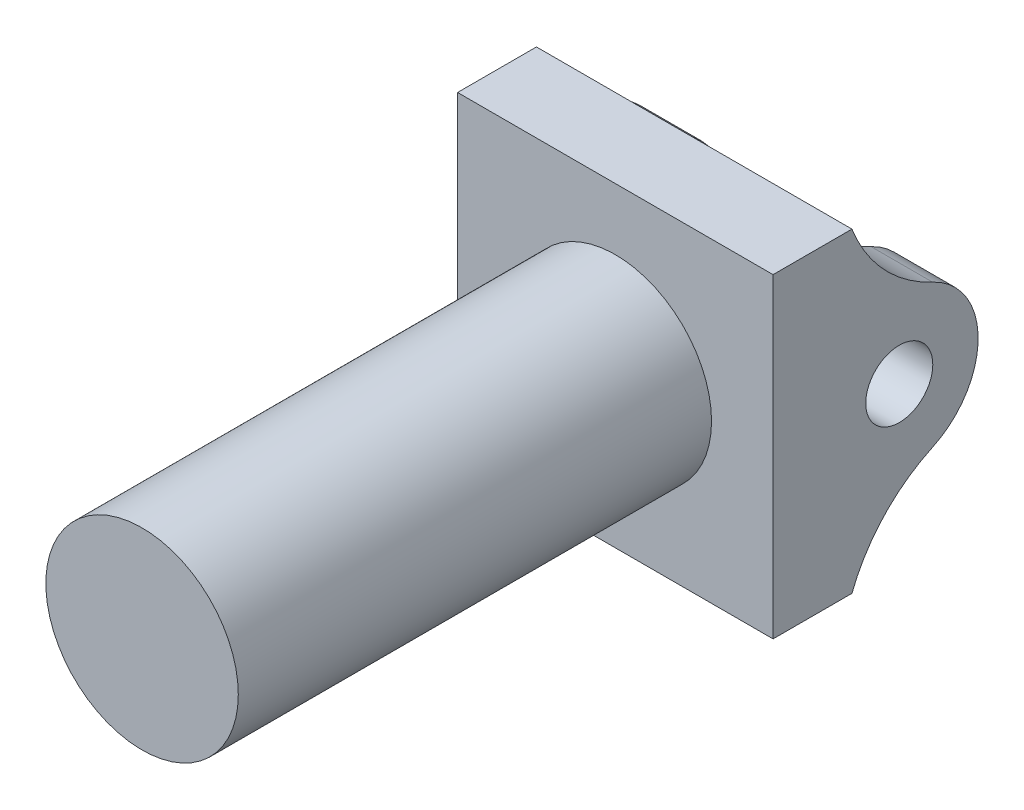
ISO-10303-21;
HEADER;
FILE_DESCRIPTION(('STEP AP214'),'2;1');
FILE_NAME('part.step','',(''),(''),'','','');
FILE_SCHEMA(('AUTOMOTIVE_DESIGN { 1 0 10303 214 1 1 1 1 }'));
ENDSEC;
DATA;
#1=APPLICATION_CONTEXT('core data for automotive mechanical design processes');
#2=APPLICATION_PROTOCOL_DEFINITION('international standard','automotive_design',2000,#1);
#3=PRODUCT_CONTEXT('',#1,'mechanical');
#4=PRODUCT('Part','Part','',(#3));
#5=PRODUCT_RELATED_PRODUCT_CATEGORY('part','',(#4));
#6=PRODUCT_DEFINITION_FORMATION('','',#4);
#7=PRODUCT_DEFINITION_CONTEXT('part definition',#1,'design');
#8=PRODUCT_DEFINITION('design','',#6,#7);
#9=PRODUCT_DEFINITION_SHAPE('','',#8);
#10=(LENGTH_UNIT() NAMED_UNIT(*) SI_UNIT(.MILLI.,.METRE.));
#11=(NAMED_UNIT(*) PLANE_ANGLE_UNIT() SI_UNIT($,.RADIAN.));
#12=(NAMED_UNIT(*) SI_UNIT($,.STERADIAN.) SOLID_ANGLE_UNIT());
#13=UNCERTAINTY_MEASURE_WITH_UNIT(LENGTH_MEASURE(1.E-05),#10,'distance_accuracy_value','');
#14=(GEOMETRIC_REPRESENTATION_CONTEXT(3) GLOBAL_UNCERTAINTY_ASSIGNED_CONTEXT((#13)) GLOBAL_UNIT_ASSIGNED_CONTEXT((#10,
#11,#12)) REPRESENTATION_CONTEXT('',''));
#15=CARTESIAN_POINT('',(0.,0.,0.));
#16=DIRECTION('',(0.,0.,1.));
#17=DIRECTION('',(1.,0.,0.));
#18=AXIS2_PLACEMENT_3D('',#15,#16,#17);
#19=CARTESIAN_POINT('',(-10.,0.,-8.));
#20=DIRECTION('',(1.,0.,0.));
#21=DIRECTION('',(0.,0.,-1.));
#22=AXIS2_PLACEMENT_3D('',#19,#20,#21);
#23=CYLINDRICAL_SURFACE('',#22,5.);
#24=CARTESIAN_POINT('',(6.1,0.,-8.));
#25=DIRECTION('',(-1.,0.,0.));
#26=DIRECTION('',(0.,0.,1.));
#27=AXIS2_PLACEMENT_3D('',#24,#25,#26);
#28=CIRCLE('',#27,5.);
#29=CARTESIAN_POINT('',(6.1,-4.53299182970078,-10.1099727656693));
#30=VERTEX_POINT('',#29);
#31=CARTESIAN_POINT('',(6.1,4.53299182970078,-10.1099727656693));
#32=VERTEX_POINT('',#31);
#33=EDGE_CURVE('E220',#30,#32,#28,.F.);
#34=ORIENTED_EDGE('',*,*,#33,.T.);
#35=DIRECTION('',(1.,0.,0.));
#36=VECTOR('',#35,1.);
#37=CARTESIAN_POINT('',(-10.,4.53299182970078,-10.1099727656693));
#38=LINE('',#37,#36);
#39=CARTESIAN_POINT('',(10.,4.53299182970078,-10.1099727656693));
#40=VERTEX_POINT('',#39);
#41=EDGE_CURVE('E164',#32,#40,#38,.T.);
#42=ORIENTED_EDGE('',*,*,#41,.T.);
#43=CARTESIAN_POINT('',(10.,0.,-8.));
#44=DIRECTION('',(1.,0.,0.));
#45=DIRECTION('',(0.,0.,-1.));
#46=AXIS2_PLACEMENT_3D('',#43,#44,#45);
#47=CIRCLE('',#46,5.);
#48=CARTESIAN_POINT('',(10.,-4.53299182970078,-10.1099727656693));
#49=VERTEX_POINT('',#48);
#50=EDGE_CURVE('E239',#49,#40,#47,.T.);
#51=ORIENTED_EDGE('',*,*,#50,.F.);
#52=DIRECTION('',(1.,0.,0.));
#53=VECTOR('',#52,1.);
#54=CARTESIAN_POINT('',(-10.,-4.53299182970078,-10.1099727656693));
#55=LINE('',#54,#53);
#56=EDGE_CURVE('E248',#49,#30,#55,.F.);
#57=ORIENTED_EDGE('',*,*,#56,.T.);
#58=EDGE_LOOP('',(#34,#42,#51,#57));
#59=FACE_BOUND('',#58,.T.);
#60=ADVANCED_FACE('F45',(#59),#23,.T.);
#61=CARTESIAN_POINT('',(-10.,0.,-8.));
#62=DIRECTION('',(1.,0.,0.));
#63=DIRECTION('',(0.,0.,-1.));
#64=AXIS2_PLACEMENT_3D('',#61,#62,#63);
#65=CIRCLE('',#64,5.);
#66=CARTESIAN_POINT('',(-10.,-4.53299182970078,-10.1099727656693));
#67=VERTEX_POINT('',#66);
#68=CARTESIAN_POINT('',(-10.,4.53299182970078,-10.1099727656693));
#69=VERTEX_POINT('',#68);
#70=EDGE_CURVE('E179',#67,#69,#65,.T.);
#71=ORIENTED_EDGE('',*,*,#70,.T.);
#72=DIRECTION('',(1.,0.,0.));
#73=VECTOR('',#72,1.);
#74=CARTESIAN_POINT('',(-10.,4.53299182970078,-10.1099727656693));
#75=LINE('',#74,#73);
#76=CARTESIAN_POINT('',(-6.1,4.53299182970078,-10.1099727656693));
#77=VERTEX_POINT('',#76);
#78=EDGE_CURVE('E155',#69,#77,#75,.T.);
#79=ORIENTED_EDGE('',*,*,#78,.T.);
#80=CARTESIAN_POINT('',(-6.1,0.,-8.));
#81=DIRECTION('',(1.,0.,0.));
#82=DIRECTION('',(0.,0.,-1.));
#83=AXIS2_PLACEMENT_3D('',#80,#81,#82);
#84=CIRCLE('',#83,5.);
#85=CARTESIAN_POINT('',(-6.1,-4.53299182970078,-10.1099727656693));
#86=VERTEX_POINT('',#85);
#87=EDGE_CURVE('E232',#77,#86,#84,.F.);
#88=ORIENTED_EDGE('',*,*,#87,.T.);
#89=DIRECTION('',(1.,0.,0.));
#90=VECTOR('',#89,1.);
#91=CARTESIAN_POINT('',(-10.,-4.53299182970078,-10.1099727656693));
#92=LINE('',#91,#90);
#93=EDGE_CURVE('E253',#86,#67,#92,.F.);
#94=ORIENTED_EDGE('',*,*,#93,.T.);
#95=EDGE_LOOP('',(#71,#79,#88,#94));
#96=FACE_BOUND('',#95,.T.);
#97=ADVANCED_FACE('F302',(#96),#23,.T.);
#98=CARTESIAN_POINT('',(-10.,0.,-8.));
#99=DIRECTION('',(1.,0.,0.));
#100=DIRECTION('',(0.,0.,-1.));
#101=AXIS2_PLACEMENT_3D('',#98,#99,#100);
#102=CYLINDRICAL_SURFACE('',#101,2.125);
#103=CARTESIAN_POINT('',(10.,0.,-8.));
#104=DIRECTION('',(1.,0.,0.));
#105=DIRECTION('',(0.,0.,-1.));
#106=AXIS2_PLACEMENT_3D('',#103,#104,#105);
#107=CIRCLE('',#106,2.125);
#108=CARTESIAN_POINT('',(10.,0.,-10.125));
#109=VERTEX_POINT('',#108);
#110=EDGE_CURVE('E223',#109,#109,#107,.T.);
#111=ORIENTED_EDGE('',*,*,#110,.T.);
#112=EDGE_LOOP('',(#111));
#113=FACE_BOUND('',#112,.T.);
#114=CARTESIAN_POINT('',(6.1,0.,-8.));
#115=DIRECTION('',(-1.,0.,0.));
#116=DIRECTION('',(0.,0.,1.));
#117=AXIS2_PLACEMENT_3D('',#114,#115,#116);
#118=CIRCLE('',#117,2.125);
#119=CARTESIAN_POINT('',(6.1,0.,-5.875));
#120=VERTEX_POINT('',#119);
#121=EDGE_CURVE('E224',#120,#120,#118,.F.);
#122=ORIENTED_EDGE('',*,*,#121,.F.);
#123=EDGE_LOOP('',(#122));
#124=FACE_BOUND('',#123,.T.);
#125=ADVANCED_FACE('F308',(#113,#124),#102,.F.);
#126=CARTESIAN_POINT('',(-10.,0.,-8.));
#127=DIRECTION('',(1.,0.,0.));
#128=DIRECTION('',(0.,0.,-1.));
#129=AXIS2_PLACEMENT_3D('',#126,#127,#128);
#130=CIRCLE('',#129,2.125);
#131=CARTESIAN_POINT('',(-10.,0.,-10.125));
#132=VERTEX_POINT('',#131);
#133=EDGE_CURVE('E229',#132,#132,#130,.T.);
#134=ORIENTED_EDGE('',*,*,#133,.F.);
#135=EDGE_LOOP('',(#134));
#136=FACE_BOUND('',#135,.T.);
#137=CARTESIAN_POINT('',(-6.1,0.,-8.));
#138=DIRECTION('',(1.,0.,0.));
#139=DIRECTION('',(0.,0.,-1.));
#140=AXIS2_PLACEMENT_3D('',#137,#138,#139);
#141=CIRCLE('',#140,2.125);
#142=CARTESIAN_POINT('',(-6.1,0.,-10.125));
#143=VERTEX_POINT('',#142);
#144=EDGE_CURVE('E259',#143,#143,#141,.F.);
#145=ORIENTED_EDGE('',*,*,#144,.F.);
#146=EDGE_LOOP('',(#145));
#147=FACE_BOUND('',#146,.T.);
#148=ADVANCED_FACE('F311',(#136,#147),#102,.F.);
#149=CARTESIAN_POINT('',(0.,0.,30.));
#150=DIRECTION('',(0.,0.,-1.));
#151=DIRECTION('',(-1.,0.,0.));
#152=AXIS2_PLACEMENT_3D('',#149,#150,#151);
#153=CYLINDRICAL_SURFACE('',#152,6.1);
#154=CARTESIAN_POINT('',(0.,0.,30.));
#155=DIRECTION('',(0.,0.,1.));
#156=DIRECTION('',(1.,0.,0.));
#157=AXIS2_PLACEMENT_3D('',#154,#155,#156);
#158=CIRCLE('',#157,6.1);
#159=CARTESIAN_POINT('',(6.1,0.,30.));
#160=VERTEX_POINT('',#159);
#161=EDGE_CURVE('E257',#160,#160,#158,.T.);
#162=ORIENTED_EDGE('',*,*,#161,.F.);
#163=EDGE_LOOP('',(#162));
#164=FACE_BOUND('',#163,.T.);
#165=CARTESIAN_POINT('',(0.,0.,0.));
#166=DIRECTION('',(0.,0.,1.));
#167=DIRECTION('',(1.,0.,0.));
#168=AXIS2_PLACEMENT_3D('',#165,#166,#167);
#169=CIRCLE('',#168,6.1);
#170=CARTESIAN_POINT('',(6.1,0.,0.));
#171=VERTEX_POINT('',#170);
#172=EDGE_CURVE('E149',#171,#171,#169,.T.);
#173=ORIENTED_EDGE('',*,*,#172,.T.);
#174=EDGE_LOOP('',(#173));
#175=FACE_BOUND('',#174,.T.);
#176=ADVANCED_FACE('F323',(#164,#175),#153,.T.);
#177=CARTESIAN_POINT('',(0.,0.,30.));
#178=DIRECTION('',(0.,0.,1.));
#179=DIRECTION('',(1.,0.,0.));
#180=AXIS2_PLACEMENT_3D('',#177,#178,#179);
#181=PLANE('',#180);
#182=ORIENTED_EDGE('',*,*,#161,.T.);
#183=EDGE_LOOP('',(#182));
#184=FACE_BOUND('',#183,.T.);
#185=ADVANCED_FACE('F328',(#184),#181,.T.);
#186=CARTESIAN_POINT('',(-9.99999999999999,-10.,-5.));
#187=DIRECTION('',(1.,0.,0.));
#188=DIRECTION('',(0.,0.,-1.));
#189=AXIS2_PLACEMENT_3D('',#186,#187,#188);
#190=PLANE('',#189);
#191=DIRECTION('',(0.,1.,0.));
#192=VECTOR('',#191,1.);
#193=CARTESIAN_POINT('',(-9.99999999999999,-10.,0.));
#194=LINE('',#193,#192);
#195=CARTESIAN_POINT('',(-9.99999999999999,-10.,0.));
#196=VERTEX_POINT('',#195);
#197=CARTESIAN_POINT('',(-9.99999999999999,10.,0.));
#198=VERTEX_POINT('',#197);
#199=EDGE_CURVE('E147',#196,#198,#194,.T.);
#200=ORIENTED_EDGE('',*,*,#199,.T.);
#201=DIRECTION('',(0.,0.,1.));
#202=VECTOR('',#201,1.);
#203=CARTESIAN_POINT('',(-9.99999999999999,10.,-5.));
#204=LINE('',#203,#202);
#205=CARTESIAN_POINT('',(-9.99999999999999,10.,-5.));
#206=VERTEX_POINT('',#205);
#207=EDGE_CURVE('E128',#206,#198,#204,.T.);
#208=ORIENTED_EDGE('',*,*,#207,.F.);
#209=CARTESIAN_POINT('',(-9.99999999999999,13.5989754891023,-14.3299182970078));
#210=DIRECTION('',(1.,0.,0.));
#211=DIRECTION('',(0.,0.,-1.));
#212=AXIS2_PLACEMENT_3D('',#209,#210,#211);
#213=CIRCLE('',#212,10.);
#214=EDGE_CURVE('E143',#206,#69,#213,.T.);
#215=ORIENTED_EDGE('',*,*,#214,.T.);
#216=ORIENTED_EDGE('',*,*,#70,.F.);
#217=CARTESIAN_POINT('',(-9.99999999999999,-13.5989754891023,-14.3299182970078));
#218=DIRECTION('',(1.,0.,0.));
#219=DIRECTION('',(0.,0.,-1.));
#220=AXIS2_PLACEMENT_3D('',#217,#218,#219);
#221=CIRCLE('',#220,10.);
#222=CARTESIAN_POINT('',(-9.99999999999999,-10.,-5.));
#223=VERTEX_POINT('',#222);
#224=EDGE_CURVE('E173',#67,#223,#221,.T.);
#225=ORIENTED_EDGE('',*,*,#224,.T.);
#226=DIRECTION('',(0.,0.,1.));
#227=VECTOR('',#226,1.);
#228=CARTESIAN_POINT('',(-9.99999999999999,-10.,-5.));
#229=LINE('',#228,#227);
#230=EDGE_CURVE('E178',#223,#196,#229,.T.);
#231=ORIENTED_EDGE('',*,*,#230,.T.);
#232=EDGE_LOOP('',(#200,#208,#215,#216,#225,#231));
#233=FACE_BOUND('',#232,.T.);
#234=ORIENTED_EDGE('',*,*,#133,.T.);
#235=EDGE_LOOP('',(#234));
#236=FACE_BOUND('',#235,.T.);
#237=ADVANCED_FACE('F140',(#233,#236),#190,.F.);
#238=CARTESIAN_POINT('',(10.,10.,-5.));
#239=DIRECTION('',(0.,-1.,0.));
#240=DIRECTION('',(0.,0.,-1.));
#241=AXIS2_PLACEMENT_3D('',#238,#239,#240);
#242=PLANE('',#241);
#243=DIRECTION('',(1.,0.,0.));
#244=VECTOR('',#243,1.);
#245=CARTESIAN_POINT('',(10.,10.,0.));
#246=LINE('',#245,#244);
#247=CARTESIAN_POINT('',(10.,10.,0.));
#248=VERTEX_POINT('',#247);
#249=EDGE_CURVE('E278',#198,#248,#246,.T.);
#250=ORIENTED_EDGE('',*,*,#249,.T.);
#251=DIRECTION('',(0.,0.,1.));
#252=VECTOR('',#251,1.);
#253=CARTESIAN_POINT('',(10.,10.,-5.));
#254=LINE('',#253,#252);
#255=CARTESIAN_POINT('',(10.,10.,-5.));
#256=VERTEX_POINT('',#255);
#257=EDGE_CURVE('E150',#256,#248,#254,.T.);
#258=ORIENTED_EDGE('',*,*,#257,.F.);
#259=DIRECTION('',(1.,0.,0.));
#260=VECTOR('',#259,1.);
#261=CARTESIAN_POINT('',(10.,10.,-5.));
#262=LINE('',#261,#260);
#263=CARTESIAN_POINT('',(6.1,10.,-5.));
#264=VERTEX_POINT('',#263);
#265=EDGE_CURVE('E138',#264,#256,#262,.T.);
#266=ORIENTED_EDGE('',*,*,#265,.F.);
#267=CARTESIAN_POINT('',(-6.1,10.,-5.));
#268=VERTEX_POINT('',#267);
#269=EDGE_CURVE('E132',#268,#264,#262,.T.);
#270=ORIENTED_EDGE('',*,*,#269,.F.);
#271=EDGE_CURVE('E125',#206,#268,#262,.T.);
#272=ORIENTED_EDGE('',*,*,#271,.F.);
#273=ORIENTED_EDGE('',*,*,#207,.T.);
#274=EDGE_LOOP('',(#250,#258,#266,#270,#272,#273));
#275=FACE_BOUND('',#274,.T.);
#276=ADVANCED_FACE('F127',(#275),#242,.F.);
#277=CARTESIAN_POINT('',(10.,-10.,-5.));
#278=DIRECTION('',(-1.,0.,0.));
#279=DIRECTION('',(0.,0.,1.));
#280=AXIS2_PLACEMENT_3D('',#277,#278,#279);
#281=PLANE('',#280);
#282=DIRECTION('',(0.,-1.,0.));
#283=VECTOR('',#282,1.);
#284=CARTESIAN_POINT('',(10.,-10.,0.));
#285=LINE('',#284,#283);
#286=CARTESIAN_POINT('',(10.,-10.,0.));
#287=VERTEX_POINT('',#286);
#288=EDGE_CURVE('E275',#248,#287,#285,.T.);
#289=ORIENTED_EDGE('',*,*,#288,.T.);
#290=DIRECTION('',(0.,0.,1.));
#291=VECTOR('',#290,1.);
#292=CARTESIAN_POINT('',(10.,-10.,-5.));
#293=LINE('',#292,#291);
#294=CARTESIAN_POINT('',(10.,-10.,-5.));
#295=VERTEX_POINT('',#294);
#296=EDGE_CURVE('E192',#295,#287,#293,.T.);
#297=ORIENTED_EDGE('',*,*,#296,.F.);
#298=CARTESIAN_POINT('',(10.,-13.5989754891023,-14.3299182970078));
#299=DIRECTION('',(-1.,0.,0.));
#300=DIRECTION('',(0.,0.,1.));
#301=AXIS2_PLACEMENT_3D('',#298,#299,#300);
#302=CIRCLE('',#301,10.);
#303=EDGE_CURVE('E54',#295,#49,#302,.T.);
#304=ORIENTED_EDGE('',*,*,#303,.T.);
#305=ORIENTED_EDGE('',*,*,#50,.T.);
#306=CARTESIAN_POINT('',(10.,13.5989754891023,-14.3299182970078));
#307=DIRECTION('',(-1.,0.,0.));
#308=DIRECTION('',(0.,0.,1.));
#309=AXIS2_PLACEMENT_3D('',#306,#307,#308);
#310=CIRCLE('',#309,10.);
#311=EDGE_CURVE('E61',#40,#256,#310,.T.);
#312=ORIENTED_EDGE('',*,*,#311,.T.);
#313=ORIENTED_EDGE('',*,*,#257,.T.);
#314=EDGE_LOOP('',(#289,#297,#304,#305,#312,#313));
#315=FACE_BOUND('',#314,.T.);
#316=ORIENTED_EDGE('',*,*,#110,.F.);
#317=EDGE_LOOP('',(#316));
#318=FACE_BOUND('',#317,.T.);
#319=ADVANCED_FACE('F244',(#315,#318),#281,.F.);
#320=CARTESIAN_POINT('',(10.,-10.,-5.));
#321=DIRECTION('',(0.,1.,0.));
#322=DIRECTION('',(0.,0.,1.));
#323=AXIS2_PLACEMENT_3D('',#320,#321,#322);
#324=PLANE('',#323);
#325=DIRECTION('',(-1.,0.,0.));
#326=VECTOR('',#325,1.);
#327=CARTESIAN_POINT('',(10.,-10.,0.));
#328=LINE('',#327,#326);
#329=EDGE_CURVE('E190',#287,#196,#328,.T.);
#330=ORIENTED_EDGE('',*,*,#329,.T.);
#331=ORIENTED_EDGE('',*,*,#230,.F.);
#332=DIRECTION('',(-1.,0.,0.));
#333=VECTOR('',#332,1.);
#334=CARTESIAN_POINT('',(10.,-10.,-5.));
#335=LINE('',#334,#333);
#336=CARTESIAN_POINT('',(-6.1,-10.,-5.));
#337=VERTEX_POINT('',#336);
#338=EDGE_CURVE('E136',#337,#223,#335,.T.);
#339=ORIENTED_EDGE('',*,*,#338,.F.);
#340=CARTESIAN_POINT('',(6.1,-10.,-5.));
#341=VERTEX_POINT('',#340);
#342=EDGE_CURVE('E198',#341,#337,#335,.T.);
#343=ORIENTED_EDGE('',*,*,#342,.F.);
#344=EDGE_CURVE('E193',#295,#341,#335,.T.);
#345=ORIENTED_EDGE('',*,*,#344,.F.);
#346=ORIENTED_EDGE('',*,*,#296,.T.);
#347=EDGE_LOOP('',(#330,#331,#339,#343,#345,#346));
#348=FACE_BOUND('',#347,.T.);
#349=ADVANCED_FACE('F185',(#348),#324,.F.);
#350=CARTESIAN_POINT('',(0.,0.,-5.));
#351=DIRECTION('',(0.,0.,1.));
#352=DIRECTION('',(1.,0.,0.));
#353=AXIS2_PLACEMENT_3D('',#350,#351,#352);
#354=PLANE('',#353);
#355=DIRECTION('',(0.,-1.,0.));
#356=VECTOR('',#355,1.);
#357=CARTESIAN_POINT('',(-6.1,20.,-5.));
#358=LINE('',#357,#356);
#359=EDGE_CURVE('E210',#268,#337,#358,.T.);
#360=ORIENTED_EDGE('',*,*,#359,.F.);
#361=ORIENTED_EDGE('',*,*,#269,.T.);
#362=DIRECTION('',(0.,-1.,0.));
#363=VECTOR('',#362,1.);
#364=CARTESIAN_POINT('',(6.1,20.,-5.));
#365=LINE('',#364,#363);
#366=EDGE_CURVE('E211',#264,#341,#365,.T.);
#367=ORIENTED_EDGE('',*,*,#366,.T.);
#368=ORIENTED_EDGE('',*,*,#342,.T.);
#369=EDGE_LOOP('',(#360,#361,#367,#368));
#370=FACE_BOUND('',#369,.T.);
#371=ADVANCED_FACE('F209',(#370),#354,.F.);
#372=CARTESIAN_POINT('',(0.,0.,0.));
#373=DIRECTION('',(0.,0.,1.));
#374=DIRECTION('',(1.,0.,0.));
#375=AXIS2_PLACEMENT_3D('',#372,#373,#374);
#376=PLANE('',#375);
#377=ORIENTED_EDGE('',*,*,#172,.F.);
#378=EDGE_LOOP('',(#377));
#379=FACE_BOUND('',#378,.T.);
#380=ORIENTED_EDGE('',*,*,#199,.F.);
#381=ORIENTED_EDGE('',*,*,#329,.F.);
#382=ORIENTED_EDGE('',*,*,#288,.F.);
#383=ORIENTED_EDGE('',*,*,#249,.F.);
#384=EDGE_LOOP('',(#380,#381,#382,#383));
#385=FACE_BOUND('',#384,.T.);
#386=ADVANCED_FACE('F286',(#379,#385),#376,.T.);
#387=CARTESIAN_POINT('',(6.1,20.,-21.));
#388=DIRECTION('',(-1.,0.,0.));
#389=DIRECTION('',(0.,0.,1.));
#390=AXIS2_PLACEMENT_3D('',#387,#388,#389);
#391=PLANE('',#390);
#392=ORIENTED_EDGE('',*,*,#33,.F.);
#393=CARTESIAN_POINT('',(6.1,-13.5989754891023,-14.3299182970078));
#394=DIRECTION('',(-1.,0.,0.));
#395=DIRECTION('',(0.,0.,1.));
#396=AXIS2_PLACEMENT_3D('',#393,#394,#395);
#397=CIRCLE('',#396,10.);
#398=EDGE_CURVE('E11',#30,#341,#397,.F.);
#399=ORIENTED_EDGE('',*,*,#398,.T.);
#400=ORIENTED_EDGE('',*,*,#366,.F.);
#401=CARTESIAN_POINT('',(6.1,13.5989754891023,-14.3299182970078));
#402=DIRECTION('',(-1.,0.,0.));
#403=DIRECTION('',(0.,0.,1.));
#404=AXIS2_PLACEMENT_3D('',#401,#402,#403);
#405=CIRCLE('',#404,10.);
#406=EDGE_CURVE('E161',#264,#32,#405,.F.);
#407=ORIENTED_EDGE('',*,*,#406,.T.);
#408=EDGE_LOOP('',(#392,#399,#400,#407));
#409=FACE_BOUND('',#408,.T.);
#410=ORIENTED_EDGE('',*,*,#121,.T.);
#411=EDGE_LOOP('',(#410));
#412=FACE_BOUND('',#411,.T.);
#413=ADVANCED_FACE('F217',(#409,#412),#391,.T.);
#414=CARTESIAN_POINT('',(-6.1,20.,-21.));
#415=DIRECTION('',(1.,0.,0.));
#416=DIRECTION('',(0.,0.,-1.));
#417=AXIS2_PLACEMENT_3D('',#414,#415,#416);
#418=PLANE('',#417);
#419=ORIENTED_EDGE('',*,*,#359,.T.);
#420=CARTESIAN_POINT('',(-6.1,-13.5989754891023,-14.3299182970078));
#421=DIRECTION('',(1.,0.,0.));
#422=DIRECTION('',(0.,0.,-1.));
#423=AXIS2_PLACEMENT_3D('',#420,#421,#422);
#424=CIRCLE('',#423,10.);
#425=EDGE_CURVE('E170',#337,#86,#424,.F.);
#426=ORIENTED_EDGE('',*,*,#425,.T.);
#427=ORIENTED_EDGE('',*,*,#87,.F.);
#428=CARTESIAN_POINT('',(-6.1,13.5989754891023,-14.3299182970078));
#429=DIRECTION('',(1.,0.,0.));
#430=DIRECTION('',(0.,0.,-1.));
#431=AXIS2_PLACEMENT_3D('',#428,#429,#430);
#432=CIRCLE('',#431,10.);
#433=EDGE_CURVE('E157',#77,#268,#432,.F.);
#434=ORIENTED_EDGE('',*,*,#433,.T.);
#435=EDGE_LOOP('',(#419,#426,#427,#434));
#436=FACE_BOUND('',#435,.T.);
#437=ORIENTED_EDGE('',*,*,#144,.T.);
#438=EDGE_LOOP('',(#437));
#439=FACE_BOUND('',#438,.T.);
#440=ADVANCED_FACE('F295',(#436,#439),#418,.T.);
#441=CARTESIAN_POINT('',(0.,13.5989754891023,-14.3299182970078));
#442=DIRECTION('',(-1.,0.,0.));
#443=DIRECTION('',(0.,0.,1.));
#444=AXIS2_PLACEMENT_3D('',#441,#442,#443);
#445=CYLINDRICAL_SURFACE('',#444,10.);
#446=ORIENTED_EDGE('',*,*,#214,.F.);
#447=ORIENTED_EDGE('',*,*,#271,.T.);
#448=ORIENTED_EDGE('',*,*,#433,.F.);
#449=ORIENTED_EDGE('',*,*,#78,.F.);
#450=EDGE_LOOP('',(#446,#447,#448,#449));
#451=FACE_BOUND('',#450,.T.);
#452=ADVANCED_FACE('F153',(#451),#445,.F.);
#453=CARTESIAN_POINT('',(0.,13.5989754891023,-14.3299182970078));
#454=DIRECTION('',(-1.,0.,0.));
#455=DIRECTION('',(0.,0.,1.));
#456=AXIS2_PLACEMENT_3D('',#453,#454,#455);
#457=CYLINDRICAL_SURFACE('',#456,10.);
#458=ORIENTED_EDGE('',*,*,#406,.F.);
#459=ORIENTED_EDGE('',*,*,#265,.T.);
#460=ORIENTED_EDGE('',*,*,#311,.F.);
#461=ORIENTED_EDGE('',*,*,#41,.F.);
#462=EDGE_LOOP('',(#458,#459,#460,#461));
#463=FACE_BOUND('',#462,.T.);
#464=ADVANCED_FACE('F283',(#463),#457,.F.);
#465=CARTESIAN_POINT('',(-10.,-13.5989754891023,-14.3299182970078));
#466=DIRECTION('',(-1.,0.,0.));
#467=DIRECTION('',(0.,0.,1.));
#468=AXIS2_PLACEMENT_3D('',#465,#466,#467);
#469=CYLINDRICAL_SURFACE('',#468,10.);
#470=ORIENTED_EDGE('',*,*,#224,.F.);
#471=ORIENTED_EDGE('',*,*,#93,.F.);
#472=ORIENTED_EDGE('',*,*,#425,.F.);
#473=ORIENTED_EDGE('',*,*,#338,.T.);
#474=EDGE_LOOP('',(#470,#471,#472,#473));
#475=FACE_BOUND('',#474,.T.);
#476=ADVANCED_FACE('F196',(#475),#469,.F.);
#477=CARTESIAN_POINT('',(-10.,-13.5989754891023,-14.3299182970078));
#478=DIRECTION('',(-1.,0.,0.));
#479=DIRECTION('',(0.,0.,1.));
#480=AXIS2_PLACEMENT_3D('',#477,#478,#479);
#481=CYLINDRICAL_SURFACE('',#480,10.);
#482=ORIENTED_EDGE('',*,*,#398,.F.);
#483=ORIENTED_EDGE('',*,*,#56,.F.);
#484=ORIENTED_EDGE('',*,*,#303,.F.);
#485=ORIENTED_EDGE('',*,*,#344,.T.);
#486=EDGE_LOOP('',(#482,#483,#484,#485));
#487=FACE_BOUND('',#486,.T.);
#488=ADVANCED_FACE('F47',(#487),#481,.F.);
#489=CLOSED_SHELL('',(#60,#97,#125,#148,#176,#185,#237,#276,#319,#349,#371,#386,#413,#440,#452,
#464,#476,#488));
#490=MANIFOLD_SOLID_BREP('B2',#489);
#491=ADVANCED_BREP_SHAPE_REPRESENTATION('',(#18,#490),#14);
#492=SHAPE_DEFINITION_REPRESENTATION(#9,#491);
ENDSEC;
END-ISO-10303-21;
